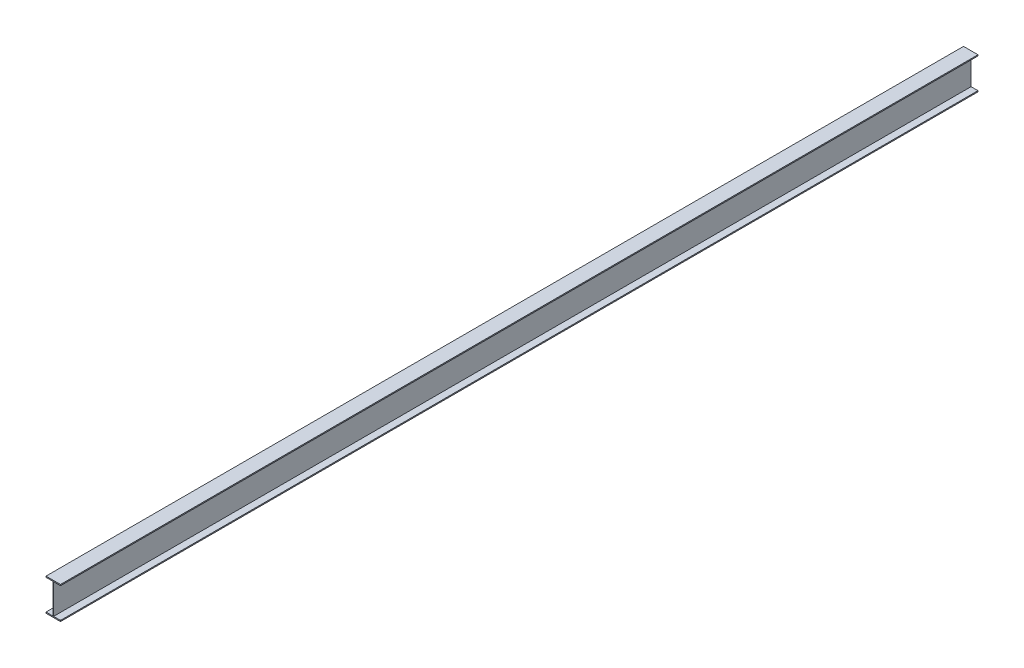
ISO-10303-21;
HEADER;
FILE_DESCRIPTION(('STEP AP214'),'2;1');
FILE_NAME('part.step','',(''),(''),'','','');
FILE_SCHEMA(('AUTOMOTIVE_DESIGN { 1 0 10303 214 1 1 1 1 }'));
ENDSEC;
DATA;
#1=APPLICATION_CONTEXT('core data for automotive mechanical design processes');
#2=APPLICATION_PROTOCOL_DEFINITION('international standard','automotive_design',2000,#1);
#3=PRODUCT_CONTEXT('',#1,'mechanical');
#4=PRODUCT('Part','Part','',(#3));
#5=PRODUCT_RELATED_PRODUCT_CATEGORY('part','',(#4));
#6=PRODUCT_DEFINITION_FORMATION('','',#4);
#7=PRODUCT_DEFINITION_CONTEXT('part definition',#1,'design');
#8=PRODUCT_DEFINITION('design','',#6,#7);
#9=PRODUCT_DEFINITION_SHAPE('','',#8);
#10=(LENGTH_UNIT() NAMED_UNIT(*) SI_UNIT(.MILLI.,.METRE.));
#11=(NAMED_UNIT(*) PLANE_ANGLE_UNIT() SI_UNIT($,.RADIAN.));
#12=(NAMED_UNIT(*) SI_UNIT($,.STERADIAN.) SOLID_ANGLE_UNIT());
#13=UNCERTAINTY_MEASURE_WITH_UNIT(LENGTH_MEASURE(1.E-05),#10,'distance_accuracy_value','');
#14=(GEOMETRIC_REPRESENTATION_CONTEXT(3) GLOBAL_UNCERTAINTY_ASSIGNED_CONTEXT((#13)) GLOBAL_UNIT_ASSIGNED_CONTEXT((#10,
#11,#12)) REPRESENTATION_CONTEXT('',''));
#15=CARTESIAN_POINT('',(0.,0.,0.));
#16=DIRECTION('',(0.,0.,1.));
#17=DIRECTION('',(1.,0.,0.));
#18=AXIS2_PLACEMENT_3D('',#15,#16,#17);
#19=CARTESIAN_POINT('',(13.175102646,-229.9737041,11400.));
#20=DIRECTION('',(1.,0.,0.));
#21=DIRECTION('',(0.,1.,0.));
#22=AXIS2_PLACEMENT_3D('',#19,#20,#21);
#23=PLANE('',#22);
#24=DIRECTION('',(0.,-1.,0.));
#25=VECTOR('',#24,1.);
#26=CARTESIAN_POINT('',(13.175102646,-229.9737041,0.));
#27=LINE('',#26,#25);
#28=CARTESIAN_POINT('',(13.175102646,143.0262959,0.));
#29=VERTEX_POINT('',#28);
#30=CARTESIAN_POINT('',(13.175102646,-229.9737041,0.));
#31=VERTEX_POINT('',#30);
#32=EDGE_CURVE('E163',#29,#31,#27,.T.);
#33=ORIENTED_EDGE('',*,*,#32,.T.);
#34=DIRECTION('',(0.,0.,-1.));
#35=VECTOR('',#34,1.);
#36=CARTESIAN_POINT('',(13.175102646,-229.9737041,11400.));
#37=LINE('',#36,#35);
#38=CARTESIAN_POINT('',(13.175102646,-229.9737041,11400.));
#39=VERTEX_POINT('',#38);
#40=EDGE_CURVE('E11',#39,#31,#37,.T.);
#41=ORIENTED_EDGE('',*,*,#40,.F.);
#42=DIRECTION('',(0.,-1.,0.));
#43=VECTOR('',#42,1.);
#44=CARTESIAN_POINT('',(13.175102646,-229.9737041,11400.));
#45=LINE('',#44,#43);
#46=CARTESIAN_POINT('',(13.175102646,143.0262959,11400.));
#47=VERTEX_POINT('',#46);
#48=EDGE_CURVE('E197',#47,#39,#45,.T.);
#49=ORIENTED_EDGE('',*,*,#48,.F.);
#50=DIRECTION('',(0.,0.,-1.));
#51=VECTOR('',#50,1.);
#52=CARTESIAN_POINT('',(13.175102646,143.0262959,11400.));
#53=LINE('',#52,#51);
#54=EDGE_CURVE('E159',#47,#29,#53,.T.);
#55=ORIENTED_EDGE('',*,*,#54,.T.);
#56=EDGE_LOOP('',(#33,#41,#49,#55));
#57=FACE_BOUND('',#56,.T.);
#58=ADVANCED_FACE('F36',(#57),#23,.F.);
#59=CARTESIAN_POINT('',(-72.52489736,-229.9737041,11400.));
#60=DIRECTION('',(0.,-1.,0.));
#61=DIRECTION('',(0.,0.,-1.));
#62=AXIS2_PLACEMENT_3D('',#59,#60,#61);
#63=PLANE('',#62);
#64=DIRECTION('',(-1.,0.,0.));
#65=VECTOR('',#64,1.);
#66=CARTESIAN_POINT('',(-72.52489736,-229.9737041,0.));
#67=LINE('',#66,#65);
#68=CARTESIAN_POINT('',(-72.52489736,-229.9737041,0.));
#69=VERTEX_POINT('',#68);
#70=EDGE_CURVE('E167',#31,#69,#67,.T.);
#71=ORIENTED_EDGE('',*,*,#70,.T.);
#72=DIRECTION('',(0.,0.,-1.));
#73=VECTOR('',#72,1.);
#74=CARTESIAN_POINT('',(-72.52489736,-229.9737041,11400.));
#75=LINE('',#74,#73);
#76=CARTESIAN_POINT('',(-72.52489736,-229.9737041,11400.));
#77=VERTEX_POINT('',#76);
#78=EDGE_CURVE('E45',#77,#69,#75,.T.);
#79=ORIENTED_EDGE('',*,*,#78,.F.);
#80=DIRECTION('',(-1.,0.,0.));
#81=VECTOR('',#80,1.);
#82=CARTESIAN_POINT('',(-72.52489736,-229.9737041,11400.));
#83=LINE('',#82,#81);
#84=EDGE_CURVE('E108',#39,#77,#83,.T.);
#85=ORIENTED_EDGE('',*,*,#84,.F.);
#86=ORIENTED_EDGE('',*,*,#40,.T.);
#87=EDGE_LOOP('',(#71,#79,#85,#86));
#88=FACE_BOUND('',#87,.T.);
#89=ADVANCED_FACE('F273',(#88),#63,.F.);
#90=CARTESIAN_POINT('',(-72.52489736,-243.4737041,11400.));
#91=DIRECTION('',(1.,0.,0.));
#92=DIRECTION('',(0.,0.,-1.));
#93=AXIS2_PLACEMENT_3D('',#90,#91,#92);
#94=PLANE('',#93);
#95=DIRECTION('',(0.,-1.,0.));
#96=VECTOR('',#95,1.);
#97=CARTESIAN_POINT('',(-72.52489736,-243.4737041,0.));
#98=LINE('',#97,#96);
#99=CARTESIAN_POINT('',(-72.52489736,-243.4737041,0.));
#100=VERTEX_POINT('',#99);
#101=EDGE_CURVE('E170',#69,#100,#98,.T.);
#102=ORIENTED_EDGE('',*,*,#101,.T.);
#103=DIRECTION('',(0.,0.,-1.));
#104=VECTOR('',#103,1.);
#105=CARTESIAN_POINT('',(-72.52489736,-243.4737041,11400.));
#106=LINE('',#105,#104);
#107=CARTESIAN_POINT('',(-72.52489736,-243.4737041,11400.));
#108=VERTEX_POINT('',#107);
#109=EDGE_CURVE('E222',#108,#100,#106,.T.);
#110=ORIENTED_EDGE('',*,*,#109,.F.);
#111=DIRECTION('',(0.,-1.,0.));
#112=VECTOR('',#111,1.);
#113=CARTESIAN_POINT('',(-72.52489736,-243.4737041,11400.));
#114=LINE('',#113,#112);
#115=EDGE_CURVE('E232',#77,#108,#114,.T.);
#116=ORIENTED_EDGE('',*,*,#115,.F.);
#117=ORIENTED_EDGE('',*,*,#78,.T.);
#118=EDGE_LOOP('',(#102,#110,#116,#117));
#119=FACE_BOUND('',#118,.T.);
#120=ADVANCED_FACE('F230',(#119),#94,.F.);
#121=CARTESIAN_POINT('',(-72.52489736,-243.4737041,11400.));
#122=DIRECTION('',(0.,1.,0.));
#123=DIRECTION('',(0.,0.,1.));
#124=AXIS2_PLACEMENT_3D('',#121,#122,#123);
#125=PLANE('',#124);
#126=DIRECTION('',(1.,0.,0.));
#127=VECTOR('',#126,1.);
#128=CARTESIAN_POINT('',(-72.52489736,-243.4737041,0.));
#129=LINE('',#128,#127);
#130=CARTESIAN_POINT('',(107.4751026,-243.4737041,0.));
#131=VERTEX_POINT('',#130);
#132=EDGE_CURVE('E173',#100,#131,#129,.T.);
#133=ORIENTED_EDGE('',*,*,#132,.T.);
#134=DIRECTION('',(0.,0.,-1.));
#135=VECTOR('',#134,1.);
#136=CARTESIAN_POINT('',(107.4751026,-243.4737041,11400.));
#137=LINE('',#136,#135);
#138=CARTESIAN_POINT('',(107.4751026,-243.4737041,11400.));
#139=VERTEX_POINT('',#138);
#140=EDGE_CURVE('E218',#139,#131,#137,.T.);
#141=ORIENTED_EDGE('',*,*,#140,.F.);
#142=DIRECTION('',(1.,0.,0.));
#143=VECTOR('',#142,1.);
#144=CARTESIAN_POINT('',(-72.52489736,-243.4737041,11400.));
#145=LINE('',#144,#143);
#146=EDGE_CURVE('E251',#108,#139,#145,.T.);
#147=ORIENTED_EDGE('',*,*,#146,.F.);
#148=ORIENTED_EDGE('',*,*,#109,.T.);
#149=EDGE_LOOP('',(#133,#141,#147,#148));
#150=FACE_BOUND('',#149,.T.);
#151=ADVANCED_FACE('F241',(#150),#125,.F.);
#152=CARTESIAN_POINT('',(107.4751026,-243.4737041,11400.));
#153=DIRECTION('',(-1.,0.,0.));
#154=DIRECTION('',(0.,0.,1.));
#155=AXIS2_PLACEMENT_3D('',#152,#153,#154);
#156=PLANE('',#155);
#157=DIRECTION('',(0.,1.,0.));
#158=VECTOR('',#157,1.);
#159=CARTESIAN_POINT('',(107.4751026,-243.4737041,0.));
#160=LINE('',#159,#158);
#161=CARTESIAN_POINT('',(107.4751026,-229.9737041,0.));
#162=VERTEX_POINT('',#161);
#163=EDGE_CURVE('E176',#131,#162,#160,.T.);
#164=ORIENTED_EDGE('',*,*,#163,.T.);
#165=DIRECTION('',(0.,0.,-1.));
#166=VECTOR('',#165,1.);
#167=CARTESIAN_POINT('',(107.4751026,-229.9737041,11400.));
#168=LINE('',#167,#166);
#169=CARTESIAN_POINT('',(107.4751026,-229.9737041,11400.));
#170=VERTEX_POINT('',#169);
#171=EDGE_CURVE('E214',#170,#162,#168,.T.);
#172=ORIENTED_EDGE('',*,*,#171,.F.);
#173=DIRECTION('',(0.,1.,0.));
#174=VECTOR('',#173,1.);
#175=CARTESIAN_POINT('',(107.4751026,-243.4737041,11400.));
#176=LINE('',#175,#174);
#177=EDGE_CURVE('E247',#139,#170,#176,.T.);
#178=ORIENTED_EDGE('',*,*,#177,.F.);
#179=ORIENTED_EDGE('',*,*,#140,.T.);
#180=EDGE_LOOP('',(#164,#172,#178,#179));
#181=FACE_BOUND('',#180,.T.);
#182=ADVANCED_FACE('F245',(#181),#156,.F.);
#183=CARTESIAN_POINT('',(107.4751026,-229.9737041,11400.));
#184=DIRECTION('',(0.,-1.,0.));
#185=DIRECTION('',(0.,0.,-1.));
#186=AXIS2_PLACEMENT_3D('',#183,#184,#185);
#187=PLANE('',#186);
#188=DIRECTION('',(-1.,0.,0.));
#189=VECTOR('',#188,1.);
#190=CARTESIAN_POINT('',(107.4751026,-229.9737041,0.));
#191=LINE('',#190,#189);
#192=CARTESIAN_POINT('',(21.77510265,-229.9737041,0.));
#193=VERTEX_POINT('',#192);
#194=EDGE_CURVE('E179',#162,#193,#191,.T.);
#195=ORIENTED_EDGE('',*,*,#194,.T.);
#196=DIRECTION('',(0.,0.,-1.));
#197=VECTOR('',#196,1.);
#198=CARTESIAN_POINT('',(21.77510265,-229.9737041,11400.));
#199=LINE('',#198,#197);
#200=CARTESIAN_POINT('',(21.77510265,-229.9737041,11400.));
#201=VERTEX_POINT('',#200);
#202=EDGE_CURVE('E210',#201,#193,#199,.T.);
#203=ORIENTED_EDGE('',*,*,#202,.F.);
#204=DIRECTION('',(-1.,0.,0.));
#205=VECTOR('',#204,1.);
#206=CARTESIAN_POINT('',(107.4751026,-229.9737041,11400.));
#207=LINE('',#206,#205);
#208=EDGE_CURVE('E250',#170,#201,#207,.T.);
#209=ORIENTED_EDGE('',*,*,#208,.F.);
#210=ORIENTED_EDGE('',*,*,#171,.T.);
#211=EDGE_LOOP('',(#195,#203,#209,#210));
#212=FACE_BOUND('',#211,.T.);
#213=ADVANCED_FACE('F285',(#212),#187,.F.);
#214=CARTESIAN_POINT('',(21.77510265,-229.9737041,11400.));
#215=DIRECTION('',(-1.,0.,0.));
#216=DIRECTION('',(0.,-1.,0.));
#217=AXIS2_PLACEMENT_3D('',#214,#215,#216);
#218=PLANE('',#217);
#219=DIRECTION('',(0.,1.,0.));
#220=VECTOR('',#219,1.);
#221=CARTESIAN_POINT('',(21.77510265,-229.9737041,0.));
#222=LINE('',#221,#220);
#223=CARTESIAN_POINT('',(21.77510265,143.0262959,0.));
#224=VERTEX_POINT('',#223);
#225=EDGE_CURVE('E182',#193,#224,#222,.T.);
#226=ORIENTED_EDGE('',*,*,#225,.T.);
#227=DIRECTION('',(0.,0.,-1.));
#228=VECTOR('',#227,1.);
#229=CARTESIAN_POINT('',(21.77510265,143.0262959,11400.));
#230=LINE('',#229,#228);
#231=CARTESIAN_POINT('',(21.77510265,143.0262959,11400.));
#232=VERTEX_POINT('',#231);
#233=EDGE_CURVE('E206',#232,#224,#230,.T.);
#234=ORIENTED_EDGE('',*,*,#233,.F.);
#235=DIRECTION('',(0.,1.,0.));
#236=VECTOR('',#235,1.);
#237=CARTESIAN_POINT('',(21.77510265,-229.9737041,11400.));
#238=LINE('',#237,#236);
#239=EDGE_CURVE('E254',#201,#232,#238,.T.);
#240=ORIENTED_EDGE('',*,*,#239,.F.);
#241=ORIENTED_EDGE('',*,*,#202,.T.);
#242=EDGE_LOOP('',(#226,#234,#240,#241));
#243=FACE_BOUND('',#242,.T.);
#244=ADVANCED_FACE('F288',(#243),#218,.F.);
#245=CARTESIAN_POINT('',(107.47510264,143.0262959,11400.));
#246=DIRECTION('',(0.,1.,0.));
#247=DIRECTION('',(-1.,0.,0.));
#248=AXIS2_PLACEMENT_3D('',#245,#246,#247);
#249=PLANE('',#248);
#250=DIRECTION('',(1.,0.,0.));
#251=VECTOR('',#250,1.);
#252=CARTESIAN_POINT('',(107.47510264,143.0262959,0.));
#253=LINE('',#252,#251);
#254=CARTESIAN_POINT('',(107.47510264,143.0262959,0.));
#255=VERTEX_POINT('',#254);
#256=EDGE_CURVE('E185',#224,#255,#253,.T.);
#257=ORIENTED_EDGE('',*,*,#256,.T.);
#258=DIRECTION('',(0.,0.,-1.));
#259=VECTOR('',#258,1.);
#260=CARTESIAN_POINT('',(107.47510264,143.0262959,11400.));
#261=LINE('',#260,#259);
#262=CARTESIAN_POINT('',(107.47510264,143.0262959,11400.));
#263=VERTEX_POINT('',#262);
#264=EDGE_CURVE('E202',#263,#255,#261,.T.);
#265=ORIENTED_EDGE('',*,*,#264,.F.);
#266=DIRECTION('',(1.,0.,0.));
#267=VECTOR('',#266,1.);
#268=CARTESIAN_POINT('',(107.47510264,143.0262959,11400.));
#269=LINE('',#268,#267);
#270=EDGE_CURVE('E262',#232,#263,#269,.T.);
#271=ORIENTED_EDGE('',*,*,#270,.F.);
#272=ORIENTED_EDGE('',*,*,#233,.T.);
#273=EDGE_LOOP('',(#257,#265,#271,#272));
#274=FACE_BOUND('',#273,.T.);
#275=ADVANCED_FACE('F292',(#274),#249,.F.);
#276=CARTESIAN_POINT('',(107.47510264,156.5262959,11400.));
#277=DIRECTION('',(-1.,0.,0.));
#278=DIRECTION('',(0.,0.,1.));
#279=AXIS2_PLACEMENT_3D('',#276,#277,#278);
#280=PLANE('',#279);
#281=DIRECTION('',(0.,1.,0.));
#282=VECTOR('',#281,1.);
#283=CARTESIAN_POINT('',(107.47510264,156.5262959,0.));
#284=LINE('',#283,#282);
#285=CARTESIAN_POINT('',(107.47510264,156.5262959,0.));
#286=VERTEX_POINT('',#285);
#287=EDGE_CURVE('E188',#255,#286,#284,.T.);
#288=ORIENTED_EDGE('',*,*,#287,.T.);
#289=DIRECTION('',(0.,0.,-1.));
#290=VECTOR('',#289,1.);
#291=CARTESIAN_POINT('',(107.47510264,156.5262959,11400.));
#292=LINE('',#291,#290);
#293=CARTESIAN_POINT('',(107.47510264,156.5262959,11400.));
#294=VERTEX_POINT('',#293);
#295=EDGE_CURVE('E150',#294,#286,#292,.T.);
#296=ORIENTED_EDGE('',*,*,#295,.F.);
#297=DIRECTION('',(0.,1.,0.));
#298=VECTOR('',#297,1.);
#299=CARTESIAN_POINT('',(107.47510264,156.5262959,11400.));
#300=LINE('',#299,#298);
#301=EDGE_CURVE('E139',#263,#294,#300,.T.);
#302=ORIENTED_EDGE('',*,*,#301,.F.);
#303=ORIENTED_EDGE('',*,*,#264,.T.);
#304=EDGE_LOOP('',(#288,#296,#302,#303));
#305=FACE_BOUND('',#304,.T.);
#306=ADVANCED_FACE('F296',(#305),#280,.F.);
#307=CARTESIAN_POINT('',(-72.524897354,156.5262959,11400.));
#308=DIRECTION('',(0.,-1.,0.));
#309=DIRECTION('',(0.,0.,-1.));
#310=AXIS2_PLACEMENT_3D('',#307,#308,#309);
#311=PLANE('',#310);
#312=DIRECTION('',(-1.,0.,0.));
#313=VECTOR('',#312,1.);
#314=CARTESIAN_POINT('',(-72.524897354,156.5262959,0.));
#315=LINE('',#314,#313);
#316=CARTESIAN_POINT('',(-72.524897354,156.5262959,0.));
#317=VERTEX_POINT('',#316);
#318=EDGE_CURVE('E148',#286,#317,#315,.T.);
#319=ORIENTED_EDGE('',*,*,#318,.T.);
#320=DIRECTION('',(0.,0.,-1.));
#321=VECTOR('',#320,1.);
#322=CARTESIAN_POINT('',(-72.524897354,156.5262959,11400.));
#323=LINE('',#322,#321);
#324=CARTESIAN_POINT('',(-72.524897354,156.5262959,11400.));
#325=VERTEX_POINT('',#324);
#326=EDGE_CURVE('E145',#325,#317,#323,.T.);
#327=ORIENTED_EDGE('',*,*,#326,.F.);
#328=DIRECTION('',(-1.,0.,0.));
#329=VECTOR('',#328,1.);
#330=CARTESIAN_POINT('',(-72.524897354,156.5262959,11400.));
#331=LINE('',#330,#329);
#332=EDGE_CURVE('E133',#294,#325,#331,.T.);
#333=ORIENTED_EDGE('',*,*,#332,.F.);
#334=ORIENTED_EDGE('',*,*,#295,.T.);
#335=EDGE_LOOP('',(#319,#327,#333,#334));
#336=FACE_BOUND('',#335,.T.);
#337=ADVANCED_FACE('F146',(#336),#311,.F.);
#338=CARTESIAN_POINT('',(-72.524897354,156.5262959,11400.));
#339=DIRECTION('',(1.,0.,0.));
#340=DIRECTION('',(0.,0.,-1.));
#341=AXIS2_PLACEMENT_3D('',#338,#339,#340);
#342=PLANE('',#341);
#343=DIRECTION('',(0.,-1.,0.));
#344=VECTOR('',#343,1.);
#345=CARTESIAN_POINT('',(-72.524897354,156.5262959,0.));
#346=LINE('',#345,#344);
#347=CARTESIAN_POINT('',(-72.524897354,143.0262959,0.));
#348=VERTEX_POINT('',#347);
#349=EDGE_CURVE('E94',#317,#348,#346,.T.);
#350=ORIENTED_EDGE('',*,*,#349,.T.);
#351=DIRECTION('',(0.,0.,-1.));
#352=VECTOR('',#351,1.);
#353=CARTESIAN_POINT('',(-72.524897354,143.0262959,11400.));
#354=LINE('',#353,#352);
#355=CARTESIAN_POINT('',(-72.524897354,143.0262959,11400.));
#356=VERTEX_POINT('',#355);
#357=EDGE_CURVE('E151',#356,#348,#354,.T.);
#358=ORIENTED_EDGE('',*,*,#357,.F.);
#359=DIRECTION('',(0.,-1.,0.));
#360=VECTOR('',#359,1.);
#361=CARTESIAN_POINT('',(-72.524897354,156.5262959,11400.));
#362=LINE('',#361,#360);
#363=EDGE_CURVE('E137',#325,#356,#362,.T.);
#364=ORIENTED_EDGE('',*,*,#363,.F.);
#365=ORIENTED_EDGE('',*,*,#326,.T.);
#366=EDGE_LOOP('',(#350,#358,#364,#365));
#367=FACE_BOUND('',#366,.T.);
#368=ADVANCED_FACE('F153',(#367),#342,.F.);
#369=CARTESIAN_POINT('',(-72.524897354,143.0262959,11400.));
#370=DIRECTION('',(0.,1.,0.));
#371=DIRECTION('',(-1.,0.,0.));
#372=AXIS2_PLACEMENT_3D('',#369,#370,#371);
#373=PLANE('',#372);
#374=DIRECTION('',(1.,0.,0.));
#375=VECTOR('',#374,1.);
#376=CARTESIAN_POINT('',(-72.524897354,143.0262959,0.));
#377=LINE('',#376,#375);
#378=EDGE_CURVE('E100',#348,#29,#377,.T.);
#379=ORIENTED_EDGE('',*,*,#378,.T.);
#380=ORIENTED_EDGE('',*,*,#54,.F.);
#381=DIRECTION('',(1.,0.,0.));
#382=VECTOR('',#381,1.);
#383=CARTESIAN_POINT('',(-72.524897354,143.0262959,11400.));
#384=LINE('',#383,#382);
#385=EDGE_CURVE('E53',#356,#47,#384,.T.);
#386=ORIENTED_EDGE('',*,*,#385,.F.);
#387=ORIENTED_EDGE('',*,*,#357,.T.);
#388=EDGE_LOOP('',(#379,#380,#386,#387));
#389=FACE_BOUND('',#388,.T.);
#390=ADVANCED_FACE('F305',(#389),#373,.F.);
#391=CARTESIAN_POINT('',(13.175102646,143.0262959,11400.));
#392=DIRECTION('',(0.,0.,-1.));
#393=DIRECTION('',(-1.,0.,0.));
#394=AXIS2_PLACEMENT_3D('',#391,#392,#393);
#395=PLANE('',#394);
#396=ORIENTED_EDGE('',*,*,#48,.T.);
#397=ORIENTED_EDGE('',*,*,#84,.T.);
#398=ORIENTED_EDGE('',*,*,#115,.T.);
#399=ORIENTED_EDGE('',*,*,#146,.T.);
#400=ORIENTED_EDGE('',*,*,#177,.T.);
#401=ORIENTED_EDGE('',*,*,#208,.T.);
#402=ORIENTED_EDGE('',*,*,#239,.T.);
#403=ORIENTED_EDGE('',*,*,#270,.T.);
#404=ORIENTED_EDGE('',*,*,#301,.T.);
#405=ORIENTED_EDGE('',*,*,#332,.T.);
#406=ORIENTED_EDGE('',*,*,#363,.T.);
#407=ORIENTED_EDGE('',*,*,#385,.T.);
#408=EDGE_LOOP('',(#396,#397,#398,#399,#400,#401,#402,#403,#404,#405,#406,#407));
#409=FACE_BOUND('',#408,.T.);
#410=ADVANCED_FACE('F135',(#409),#395,.F.);
#411=CARTESIAN_POINT('',(13.175102646,143.0262959,0.));
#412=DIRECTION('',(0.,0.,-1.));
#413=DIRECTION('',(-1.,0.,0.));
#414=AXIS2_PLACEMENT_3D('',#411,#412,#413);
#415=PLANE('',#414);
#416=ORIENTED_EDGE('',*,*,#32,.F.);
#417=ORIENTED_EDGE('',*,*,#378,.F.);
#418=ORIENTED_EDGE('',*,*,#349,.F.);
#419=ORIENTED_EDGE('',*,*,#318,.F.);
#420=ORIENTED_EDGE('',*,*,#287,.F.);
#421=ORIENTED_EDGE('',*,*,#256,.F.);
#422=ORIENTED_EDGE('',*,*,#225,.F.);
#423=ORIENTED_EDGE('',*,*,#194,.F.);
#424=ORIENTED_EDGE('',*,*,#163,.F.);
#425=ORIENTED_EDGE('',*,*,#132,.F.);
#426=ORIENTED_EDGE('',*,*,#101,.F.);
#427=ORIENTED_EDGE('',*,*,#70,.F.);
#428=EDGE_LOOP('',(#416,#417,#418,#419,#420,#421,#422,#423,#424,#425,#426,#427));
#429=FACE_BOUND('',#428,.T.);
#430=ADVANCED_FACE('F236',(#429),#415,.T.);
#431=CLOSED_SHELL('',(#58,#89,#120,#151,#182,#213,#244,#275,#306,#337,#368,#390,#410,#430));
#432=MANIFOLD_SOLID_BREP('B2',#431);
#433=ADVANCED_BREP_SHAPE_REPRESENTATION('',(#18,#432),#14);
#434=SHAPE_DEFINITION_REPRESENTATION(#9,#433);
ENDSEC;
END-ISO-10303-21;
